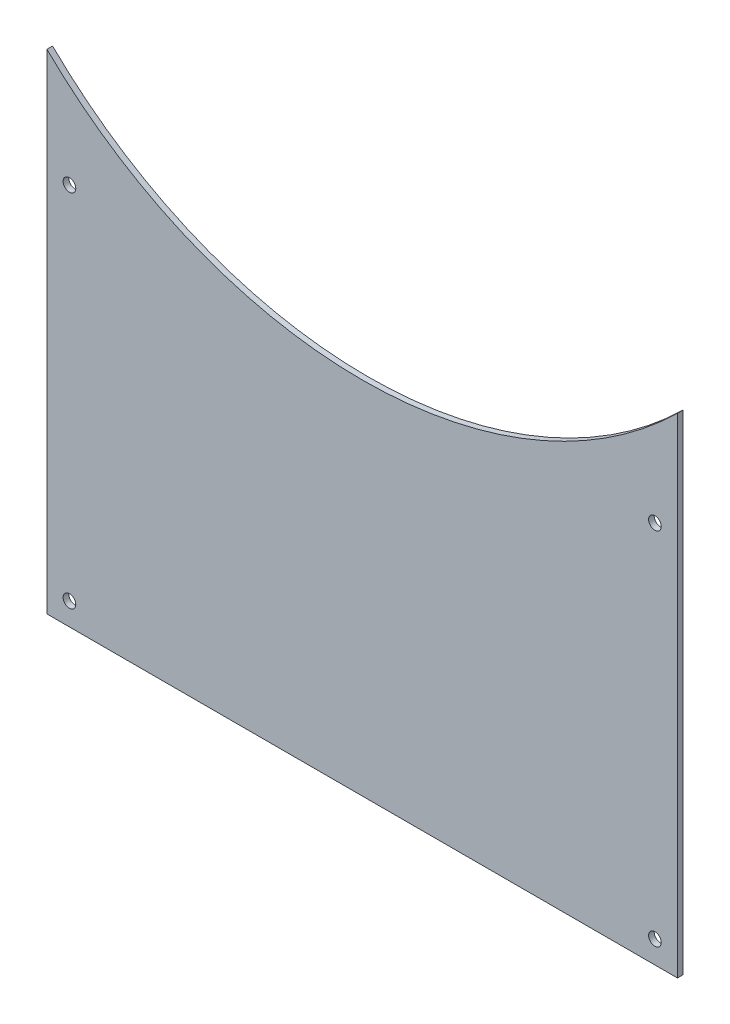
ISO-10303-21;
HEADER;
FILE_DESCRIPTION(('STEP AP214'),'2;1');
FILE_NAME('part.step','',(''),(''),'','','');
FILE_SCHEMA(('AUTOMOTIVE_DESIGN { 1 0 10303 214 1 1 1 1 }'));
ENDSEC;
DATA;
#1=APPLICATION_CONTEXT('core data for automotive mechanical design processes');
#2=APPLICATION_PROTOCOL_DEFINITION('international standard','automotive_design',2000,#1);
#3=PRODUCT_CONTEXT('',#1,'mechanical');
#4=PRODUCT('Part','Part','',(#3));
#5=PRODUCT_RELATED_PRODUCT_CATEGORY('part','',(#4));
#6=PRODUCT_DEFINITION_FORMATION('','',#4);
#7=PRODUCT_DEFINITION_CONTEXT('part definition',#1,'design');
#8=PRODUCT_DEFINITION('design','',#6,#7);
#9=PRODUCT_DEFINITION_SHAPE('','',#8);
#10=(LENGTH_UNIT() NAMED_UNIT(*) SI_UNIT(.MILLI.,.METRE.));
#11=(NAMED_UNIT(*) PLANE_ANGLE_UNIT() SI_UNIT($,.RADIAN.));
#12=(NAMED_UNIT(*) SI_UNIT($,.STERADIAN.) SOLID_ANGLE_UNIT());
#13=UNCERTAINTY_MEASURE_WITH_UNIT(LENGTH_MEASURE(1.E-05),#10,'distance_accuracy_value','');
#14=(GEOMETRIC_REPRESENTATION_CONTEXT(3) GLOBAL_UNCERTAINTY_ASSIGNED_CONTEXT((#13)) GLOBAL_UNIT_ASSIGNED_CONTEXT((#10,
#11,#12)) REPRESENTATION_CONTEXT('',''));
#15=CARTESIAN_POINT('',(0.,0.,0.));
#16=DIRECTION('',(0.,0.,1.));
#17=DIRECTION('',(1.,0.,0.));
#18=AXIS2_PLACEMENT_3D('',#15,#16,#17);
#19=CARTESIAN_POINT('',(0.,0.,3.175));
#20=DIRECTION('',(1.,0.,0.));
#21=DIRECTION('',(0.,1.,0.));
#22=AXIS2_PLACEMENT_3D('',#19,#20,#21);
#23=PLANE('',#22);
#24=DIRECTION('',(0.,-1.,0.));
#25=VECTOR('',#24,1.);
#26=CARTESIAN_POINT('',(0.,0.,3.175));
#27=LINE('',#26,#25);
#28=CARTESIAN_POINT('',(0.,-3.59228208498843,3.175));
#29=VERTEX_POINT('',#28);
#30=CARTESIAN_POINT('',(0.,-279.4,3.175));
#31=VERTEX_POINT('',#30);
#32=EDGE_CURVE('E114',#29,#31,#27,.T.);
#33=ORIENTED_EDGE('',*,*,#32,.F.);
#34=DIRECTION('',(0.,0.,1.));
#35=VECTOR('',#34,1.);
#36=CARTESIAN_POINT('',(0.,-3.59228208498843,-0.00100000000000013));
#37=LINE('',#36,#35);
#38=CARTESIAN_POINT('',(0.,-3.59228208498843,0.));
#39=VERTEX_POINT('',#38);
#40=EDGE_CURVE('E163',#39,#29,#37,.T.);
#41=ORIENTED_EDGE('',*,*,#40,.F.);
#42=DIRECTION('',(0.,-1.,0.));
#43=VECTOR('',#42,1.);
#44=CARTESIAN_POINT('',(0.,0.,0.));
#45=LINE('',#44,#43);
#46=CARTESIAN_POINT('',(0.,-279.4,0.));
#47=VERTEX_POINT('',#46);
#48=EDGE_CURVE('E104',#39,#47,#45,.T.);
#49=ORIENTED_EDGE('',*,*,#48,.T.);
#50=DIRECTION('',(0.,0.,-1.));
#51=VECTOR('',#50,1.);
#52=CARTESIAN_POINT('',(0.,-279.4,3.175));
#53=LINE('',#52,#51);
#54=EDGE_CURVE('E13',#31,#47,#53,.T.);
#55=ORIENTED_EDGE('',*,*,#54,.F.);
#56=EDGE_LOOP('',(#33,#41,#49,#55));
#57=FACE_BOUND('',#56,.T.);
#58=ADVANCED_FACE('F58',(#57),#23,.F.);
#59=CARTESIAN_POINT('',(0.,-279.4,3.175));
#60=DIRECTION('',(0.,1.,0.));
#61=DIRECTION('',(0.,0.,1.));
#62=AXIS2_PLACEMENT_3D('',#59,#60,#61);
#63=PLANE('',#62);
#64=DIRECTION('',(1.,0.,0.));
#65=VECTOR('',#64,1.);
#66=CARTESIAN_POINT('',(0.,-279.4,0.));
#67=LINE('',#66,#65);
#68=CARTESIAN_POINT('',(355.6,-279.4,0.));
#69=VERTEX_POINT('',#68);
#70=EDGE_CURVE('E94',#47,#69,#67,.T.);
#71=ORIENTED_EDGE('',*,*,#70,.T.);
#72=DIRECTION('',(0.,0.,-1.));
#73=VECTOR('',#72,1.);
#74=CARTESIAN_POINT('',(355.6,-279.4,3.175));
#75=LINE('',#74,#73);
#76=CARTESIAN_POINT('',(355.6,-279.4,3.175));
#77=VERTEX_POINT('',#76);
#78=EDGE_CURVE('E66',#77,#69,#75,.T.);
#79=ORIENTED_EDGE('',*,*,#78,.F.);
#80=DIRECTION('',(1.,0.,0.));
#81=VECTOR('',#80,1.);
#82=CARTESIAN_POINT('',(0.,-279.4,3.175));
#83=LINE('',#82,#81);
#84=EDGE_CURVE('E82',#31,#77,#83,.T.);
#85=ORIENTED_EDGE('',*,*,#84,.F.);
#86=ORIENTED_EDGE('',*,*,#54,.T.);
#87=EDGE_LOOP('',(#71,#79,#85,#86));
#88=FACE_BOUND('',#87,.T.);
#89=ADVANCED_FACE('F96',(#88),#63,.F.);
#90=CARTESIAN_POINT('',(355.6,0.,3.175));
#91=DIRECTION('',(-1.,0.,0.));
#92=DIRECTION('',(0.,-1.,0.));
#93=AXIS2_PLACEMENT_3D('',#90,#91,#92);
#94=PLANE('',#93);
#95=DIRECTION('',(0.,1.,0.));
#96=VECTOR('',#95,1.);
#97=CARTESIAN_POINT('',(355.6,0.,0.));
#98=LINE('',#97,#96);
#99=CARTESIAN_POINT('',(355.6,-3.59228208498838,0.));
#100=VERTEX_POINT('',#99);
#101=EDGE_CURVE('E103',#69,#100,#98,.T.);
#102=ORIENTED_EDGE('',*,*,#101,.T.);
#103=DIRECTION('',(0.,0.,1.));
#104=VECTOR('',#103,1.);
#105=CARTESIAN_POINT('',(355.6,-3.59228208498841,-0.00100000000000013));
#106=LINE('',#105,#104);
#107=CARTESIAN_POINT('',(355.6,-3.59228208498841,3.175));
#108=VERTEX_POINT('',#107);
#109=EDGE_CURVE('E73',#108,#100,#106,.F.);
#110=ORIENTED_EDGE('',*,*,#109,.F.);
#111=DIRECTION('',(0.,1.,0.));
#112=VECTOR('',#111,1.);
#113=CARTESIAN_POINT('',(355.6,0.,3.175));
#114=LINE('',#113,#112);
#115=EDGE_CURVE('E109',#77,#108,#114,.T.);
#116=ORIENTED_EDGE('',*,*,#115,.F.);
#117=ORIENTED_EDGE('',*,*,#78,.T.);
#118=EDGE_LOOP('',(#102,#110,#116,#117));
#119=FACE_BOUND('',#118,.T.);
#120=ADVANCED_FACE('F108',(#119),#94,.F.);
#121=CARTESIAN_POINT('',(0.,0.,3.175));
#122=DIRECTION('',(0.,0.,1.));
#123=DIRECTION('',(1.,0.,0.));
#124=AXIS2_PLACEMENT_3D('',#121,#122,#123);
#125=PLANE('',#124);
#126=CARTESIAN_POINT('',(177.8,177.8,3.175));
#127=DIRECTION('',(0.,0.,1.));
#128=DIRECTION('',(1.,0.,0.));
#129=AXIS2_PLACEMENT_3D('',#126,#127,#128);
#130=CIRCLE('',#129,254.);
#131=EDGE_CURVE('E160',#29,#108,#130,.T.);
#132=ORIENTED_EDGE('',*,*,#131,.F.);
#133=ORIENTED_EDGE('',*,*,#32,.T.);
#134=ORIENTED_EDGE('',*,*,#84,.T.);
#135=ORIENTED_EDGE('',*,*,#115,.T.);
#136=EDGE_LOOP('',(#132,#133,#134,#135));
#137=FACE_BOUND('',#136,.T.);
#138=CARTESIAN_POINT('',(342.9,-266.7,3.175));
#139=DIRECTION('',(0.,0.,1.));
#140=DIRECTION('',(1.,0.,0.));
#141=AXIS2_PLACEMENT_3D('',#138,#139,#140);
#142=CIRCLE('',#141,3.57123999999998);
#143=CARTESIAN_POINT('',(346.47124,-266.7,3.175));
#144=VERTEX_POINT('',#143);
#145=EDGE_CURVE('E154',#144,#144,#142,.T.);
#146=ORIENTED_EDGE('',*,*,#145,.F.);
#147=EDGE_LOOP('',(#146));
#148=FACE_BOUND('',#147,.T.);
#149=CARTESIAN_POINT('',(12.7,-266.7,3.175));
#150=DIRECTION('',(0.,0.,1.));
#151=DIRECTION('',(1.,0.,0.));
#152=AXIS2_PLACEMENT_3D('',#149,#150,#151);
#153=CIRCLE('',#152,3.57123999999999);
#154=CARTESIAN_POINT('',(16.27124,-266.7,3.175));
#155=VERTEX_POINT('',#154);
#156=EDGE_CURVE('E146',#155,#155,#153,.T.);
#157=ORIENTED_EDGE('',*,*,#156,.F.);
#158=EDGE_LOOP('',(#157));
#159=FACE_BOUND('',#158,.T.);
#160=CARTESIAN_POINT('',(12.7,-63.4999999999999,3.175));
#161=DIRECTION('',(0.,0.,1.));
#162=DIRECTION('',(1.,0.,0.));
#163=AXIS2_PLACEMENT_3D('',#160,#161,#162);
#164=CIRCLE('',#163,3.57123999999999);
#165=CARTESIAN_POINT('',(16.27124,-63.4999999999999,3.175));
#166=VERTEX_POINT('',#165);
#167=EDGE_CURVE('E138',#166,#166,#164,.T.);
#168=ORIENTED_EDGE('',*,*,#167,.F.);
#169=EDGE_LOOP('',(#168));
#170=FACE_BOUND('',#169,.T.);
#171=CARTESIAN_POINT('',(342.9,-63.4999999999999,3.175));
#172=DIRECTION('',(0.,0.,1.));
#173=DIRECTION('',(1.,0.,0.));
#174=AXIS2_PLACEMENT_3D('',#171,#172,#173);
#175=CIRCLE('',#174,3.57123999999998);
#176=CARTESIAN_POINT('',(346.47124,-63.4999999999999,3.175));
#177=VERTEX_POINT('',#176);
#178=EDGE_CURVE('E130',#177,#177,#175,.T.);
#179=ORIENTED_EDGE('',*,*,#178,.F.);
#180=EDGE_LOOP('',(#179));
#181=FACE_BOUND('',#180,.T.);
#182=ADVANCED_FACE('F215',(#137,#148,#159,#170,#181),#125,.T.);
#183=CARTESIAN_POINT('',(0.,0.,0.));
#184=DIRECTION('',(0.,0.,1.));
#185=DIRECTION('',(1.,0.,0.));
#186=AXIS2_PLACEMENT_3D('',#183,#184,#185);
#187=PLANE('',#186);
#188=CARTESIAN_POINT('',(342.9,-266.7,0.));
#189=DIRECTION('',(0.,0.,1.));
#190=DIRECTION('',(1.,0.,0.));
#191=AXIS2_PLACEMENT_3D('',#188,#189,#190);
#192=CIRCLE('',#191,3.57123999999998);
#193=CARTESIAN_POINT('',(346.47124,-266.7,0.));
#194=VERTEX_POINT('',#193);
#195=EDGE_CURVE('E150',#194,#194,#192,.T.);
#196=ORIENTED_EDGE('',*,*,#195,.T.);
#197=EDGE_LOOP('',(#196));
#198=FACE_BOUND('',#197,.T.);
#199=CARTESIAN_POINT('',(12.7,-266.7,0.));
#200=DIRECTION('',(0.,0.,1.));
#201=DIRECTION('',(1.,0.,0.));
#202=AXIS2_PLACEMENT_3D('',#199,#200,#201);
#203=CIRCLE('',#202,3.57123999999999);
#204=CARTESIAN_POINT('',(16.27124,-266.7,0.));
#205=VERTEX_POINT('',#204);
#206=EDGE_CURVE('E142',#205,#205,#203,.T.);
#207=ORIENTED_EDGE('',*,*,#206,.T.);
#208=EDGE_LOOP('',(#207));
#209=FACE_BOUND('',#208,.T.);
#210=CARTESIAN_POINT('',(12.7,-63.4999999999999,0.));
#211=DIRECTION('',(0.,0.,1.));
#212=DIRECTION('',(1.,0.,0.));
#213=AXIS2_PLACEMENT_3D('',#210,#211,#212);
#214=CIRCLE('',#213,3.57123999999999);
#215=CARTESIAN_POINT('',(16.27124,-63.4999999999999,0.));
#216=VERTEX_POINT('',#215);
#217=EDGE_CURVE('E134',#216,#216,#214,.T.);
#218=ORIENTED_EDGE('',*,*,#217,.T.);
#219=EDGE_LOOP('',(#218));
#220=FACE_BOUND('',#219,.T.);
#221=CARTESIAN_POINT('',(342.9,-63.4999999999999,0.));
#222=DIRECTION('',(0.,0.,1.));
#223=DIRECTION('',(1.,0.,0.));
#224=AXIS2_PLACEMENT_3D('',#221,#222,#223);
#225=CIRCLE('',#224,3.57123999999998);
#226=CARTESIAN_POINT('',(346.47124,-63.4999999999999,0.));
#227=VERTEX_POINT('',#226);
#228=EDGE_CURVE('E122',#227,#227,#225,.T.);
#229=ORIENTED_EDGE('',*,*,#228,.T.);
#230=EDGE_LOOP('',(#229));
#231=FACE_BOUND('',#230,.T.);
#232=ORIENTED_EDGE('',*,*,#48,.F.);
#233=CARTESIAN_POINT('',(177.8,177.8,0.));
#234=DIRECTION('',(0.,0.,1.));
#235=DIRECTION('',(1.,0.,0.));
#236=AXIS2_PLACEMENT_3D('',#233,#234,#235);
#237=CIRCLE('',#236,254.);
#238=EDGE_CURVE('E112',#100,#39,#237,.F.);
#239=ORIENTED_EDGE('',*,*,#238,.F.);
#240=ORIENTED_EDGE('',*,*,#101,.F.);
#241=ORIENTED_EDGE('',*,*,#70,.F.);
#242=EDGE_LOOP('',(#232,#239,#240,#241));
#243=FACE_BOUND('',#242,.T.);
#244=ADVANCED_FACE('F111',(#198,#209,#220,#231,#243),#187,.F.);
#245=CARTESIAN_POINT('',(342.9,-63.4999999999999,3.175));
#246=DIRECTION('',(0.,0.,1.));
#247=DIRECTION('',(1.,0.,0.));
#248=AXIS2_PLACEMENT_3D('',#245,#246,#247);
#249=CYLINDRICAL_SURFACE('',#248,3.57123999999998);
#250=ORIENTED_EDGE('',*,*,#228,.F.);
#251=EDGE_LOOP('',(#250));
#252=FACE_BOUND('',#251,.T.);
#253=ORIENTED_EDGE('',*,*,#178,.T.);
#254=EDGE_LOOP('',(#253));
#255=FACE_BOUND('',#254,.T.);
#256=ADVANCED_FACE('F231',(#252,#255),#249,.F.);
#257=CARTESIAN_POINT('',(12.7,-63.4999999999999,3.175));
#258=DIRECTION('',(0.,0.,1.));
#259=DIRECTION('',(1.,0.,0.));
#260=AXIS2_PLACEMENT_3D('',#257,#258,#259);
#261=CYLINDRICAL_SURFACE('',#260,3.57123999999999);
#262=ORIENTED_EDGE('',*,*,#217,.F.);
#263=EDGE_LOOP('',(#262));
#264=FACE_BOUND('',#263,.T.);
#265=ORIENTED_EDGE('',*,*,#167,.T.);
#266=EDGE_LOOP('',(#265));
#267=FACE_BOUND('',#266,.T.);
#268=ADVANCED_FACE('F236',(#264,#267),#261,.F.);
#269=CARTESIAN_POINT('',(12.7,-266.7,3.175));
#270=DIRECTION('',(0.,0.,1.));
#271=DIRECTION('',(1.,0.,0.));
#272=AXIS2_PLACEMENT_3D('',#269,#270,#271);
#273=CYLINDRICAL_SURFACE('',#272,3.57123999999999);
#274=ORIENTED_EDGE('',*,*,#206,.F.);
#275=EDGE_LOOP('',(#274));
#276=FACE_BOUND('',#275,.T.);
#277=ORIENTED_EDGE('',*,*,#156,.T.);
#278=EDGE_LOOP('',(#277));
#279=FACE_BOUND('',#278,.T.);
#280=ADVANCED_FACE('F240',(#276,#279),#273,.F.);
#281=CARTESIAN_POINT('',(342.9,-266.7,3.175));
#282=DIRECTION('',(0.,0.,1.));
#283=DIRECTION('',(1.,0.,0.));
#284=AXIS2_PLACEMENT_3D('',#281,#282,#283);
#285=CYLINDRICAL_SURFACE('',#284,3.57123999999998);
#286=ORIENTED_EDGE('',*,*,#195,.F.);
#287=EDGE_LOOP('',(#286));
#288=FACE_BOUND('',#287,.T.);
#289=ORIENTED_EDGE('',*,*,#145,.T.);
#290=EDGE_LOOP('',(#289));
#291=FACE_BOUND('',#290,.T.);
#292=ADVANCED_FACE('F244',(#288,#291),#285,.F.);
#293=CARTESIAN_POINT('',(177.8,177.8,-0.00100000000000013));
#294=DIRECTION('',(0.,0.,1.));
#295=DIRECTION('',(1.,0.,0.));
#296=AXIS2_PLACEMENT_3D('',#293,#294,#295);
#297=CYLINDRICAL_SURFACE('',#296,254.);
#298=ORIENTED_EDGE('',*,*,#40,.T.);
#299=ORIENTED_EDGE('',*,*,#131,.T.);
#300=ORIENTED_EDGE('',*,*,#109,.T.);
#301=ORIENTED_EDGE('',*,*,#238,.T.);
#302=EDGE_LOOP('',(#298,#299,#300,#301));
#303=FACE_BOUND('',#302,.T.);
#304=ADVANCED_FACE('F210',(#303),#297,.F.);
#305=CLOSED_SHELL('',(#58,#89,#120,#182,#244,#256,#268,#280,#292,#304));
#306=MANIFOLD_SOLID_BREP('B2',#305);
#307=ADVANCED_BREP_SHAPE_REPRESENTATION('',(#18,#306),#14);
#308=SHAPE_DEFINITION_REPRESENTATION(#9,#307);
ENDSEC;
END-ISO-10303-21;
